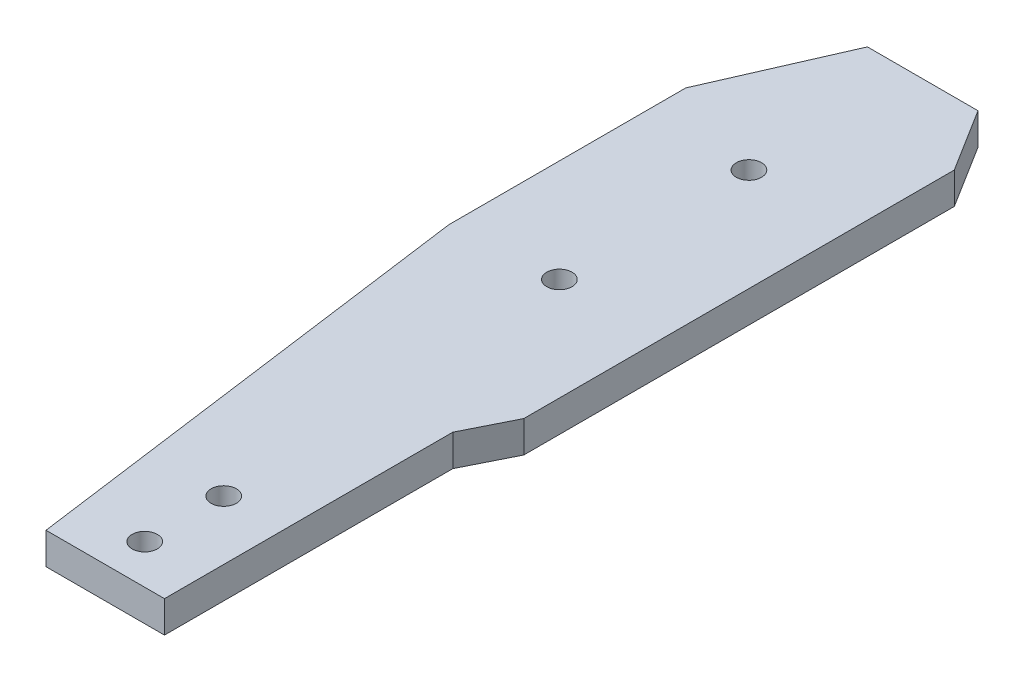
ISO-10303-21;
HEADER;
FILE_DESCRIPTION(('STEP AP214'),'2;1');
FILE_NAME('part.step','',(''),(''),'','','');
FILE_SCHEMA(('AUTOMOTIVE_DESIGN { 1 0 10303 214 1 1 1 1 }'));
ENDSEC;
DATA;
#1=APPLICATION_CONTEXT('core data for automotive mechanical design processes');
#2=APPLICATION_PROTOCOL_DEFINITION('international standard','automotive_design',2000,#1);
#3=PRODUCT_CONTEXT('',#1,'mechanical');
#4=PRODUCT('Part','Part','',(#3));
#5=PRODUCT_RELATED_PRODUCT_CATEGORY('part','',(#4));
#6=PRODUCT_DEFINITION_FORMATION('','',#4);
#7=PRODUCT_DEFINITION_CONTEXT('part definition',#1,'design');
#8=PRODUCT_DEFINITION('design','',#6,#7);
#9=PRODUCT_DEFINITION_SHAPE('','',#8);
#10=(LENGTH_UNIT() NAMED_UNIT(*) SI_UNIT(.MILLI.,.METRE.));
#11=(NAMED_UNIT(*) PLANE_ANGLE_UNIT() SI_UNIT($,.RADIAN.));
#12=(NAMED_UNIT(*) SI_UNIT($,.STERADIAN.) SOLID_ANGLE_UNIT());
#13=UNCERTAINTY_MEASURE_WITH_UNIT(LENGTH_MEASURE(1.E-05),#10,'distance_accuracy_value','');
#14=(GEOMETRIC_REPRESENTATION_CONTEXT(3) GLOBAL_UNCERTAINTY_ASSIGNED_CONTEXT((#13)) GLOBAL_UNIT_ASSIGNED_CONTEXT((#10,
#11,#12)) REPRESENTATION_CONTEXT('',''));
#15=CARTESIAN_POINT('',(0.,0.,0.));
#16=DIRECTION('',(0.,0.,1.));
#17=DIRECTION('',(1.,0.,0.));
#18=AXIS2_PLACEMENT_3D('',#15,#16,#17);
#19=CARTESIAN_POINT('',(0.,4.,0.));
#20=DIRECTION('',(0.916157334902189,0.,0.400818834019707));
#21=DIRECTION('',(0.400818834019707,0.,-0.916157334902189));
#22=AXIS2_PLACEMENT_3D('',#19,#20,#21);
#23=PLANE('',#22);
#24=DIRECTION('',(-0.400818834019707,0.,0.916157334902189));
#25=VECTOR('',#24,1.);
#26=CARTESIAN_POINT('',(0.,0.,0.));
#27=LINE('',#26,#25);
#28=CARTESIAN_POINT('',(0.,0.,0.));
#29=VERTEX_POINT('',#28);
#30=CARTESIAN_POINT('',(-6.99999999999999,0.,16.));
#31=VERTEX_POINT('',#30);
#32=EDGE_CURVE('E152',#29,#31,#27,.T.);
#33=ORIENTED_EDGE('',*,*,#32,.T.);
#34=DIRECTION('',(0.,-1.,0.));
#35=VECTOR('',#34,1.);
#36=CARTESIAN_POINT('',(-6.99999999999999,4.,16.));
#37=LINE('',#36,#35);
#38=CARTESIAN_POINT('',(-6.99999999999999,4.,16.));
#39=VERTEX_POINT('',#38);
#40=EDGE_CURVE('E13',#39,#31,#37,.T.);
#41=ORIENTED_EDGE('',*,*,#40,.F.);
#42=DIRECTION('',(-0.400818834019707,0.,0.916157334902189));
#43=VECTOR('',#42,1.);
#44=CARTESIAN_POINT('',(0.,4.,0.));
#45=LINE('',#44,#43);
#46=CARTESIAN_POINT('',(0.,4.,0.));
#47=VERTEX_POINT('',#46);
#48=EDGE_CURVE('E169',#47,#39,#45,.T.);
#49=ORIENTED_EDGE('',*,*,#48,.F.);
#50=DIRECTION('',(0.,-1.,0.));
#51=VECTOR('',#50,1.);
#52=CARTESIAN_POINT('',(0.,4.,0.));
#53=LINE('',#52,#51);
#54=EDGE_CURVE('E148',#47,#29,#53,.T.);
#55=ORIENTED_EDGE('',*,*,#54,.T.);
#56=EDGE_LOOP('',(#33,#41,#49,#55));
#57=FACE_BOUND('',#56,.T.);
#58=ADVANCED_FACE('F50',(#57),#23,.F.);
#59=CARTESIAN_POINT('',(-6.99999999999999,4.,16.));
#60=DIRECTION('',(1.,0.,0.));
#61=DIRECTION('',(0.,0.,-1.));
#62=AXIS2_PLACEMENT_3D('',#59,#60,#61);
#63=PLANE('',#62);
#64=DIRECTION('',(0.,0.,1.));
#65=VECTOR('',#64,1.);
#66=CARTESIAN_POINT('',(-6.99999999999999,0.,16.));
#67=LINE('',#66,#65);
#68=CARTESIAN_POINT('',(-6.99999999999999,0.,46.));
#69=VERTEX_POINT('',#68);
#70=EDGE_CURVE('E155',#31,#69,#67,.T.);
#71=ORIENTED_EDGE('',*,*,#70,.T.);
#72=DIRECTION('',(0.,-1.,0.));
#73=VECTOR('',#72,1.);
#74=CARTESIAN_POINT('',(-6.99999999999999,4.,46.));
#75=LINE('',#74,#73);
#76=CARTESIAN_POINT('',(-6.99999999999999,4.,46.));
#77=VERTEX_POINT('',#76);
#78=EDGE_CURVE('E58',#77,#69,#75,.T.);
#79=ORIENTED_EDGE('',*,*,#78,.F.);
#80=DIRECTION('',(0.,0.,1.));
#81=VECTOR('',#80,1.);
#82=CARTESIAN_POINT('',(-6.99999999999999,4.,16.));
#83=LINE('',#82,#81);
#84=EDGE_CURVE('E112',#39,#77,#83,.T.);
#85=ORIENTED_EDGE('',*,*,#84,.F.);
#86=ORIENTED_EDGE('',*,*,#40,.T.);
#87=EDGE_LOOP('',(#71,#79,#85,#86));
#88=FACE_BOUND('',#87,.T.);
#89=ADVANCED_FACE('F267',(#88),#63,.F.);
#90=CARTESIAN_POINT('',(-6.99999999999999,4.,46.));
#91=DIRECTION('',(0.990932088180138,0.,-0.134363672973578));
#92=DIRECTION('',(-0.134363672973578,0.,-0.990932088180138));
#93=AXIS2_PLACEMENT_3D('',#90,#91,#92);
#94=PLANE('',#93);
#95=DIRECTION('',(0.134363672973578,0.,0.990932088180138));
#96=VECTOR('',#95,1.);
#97=CARTESIAN_POINT('',(-6.99999999999999,0.,46.));
#98=LINE('',#97,#96);
#99=CARTESIAN_POINT('',(1.00000000000001,0.,105.));
#100=VERTEX_POINT('',#99);
#101=EDGE_CURVE('E158',#69,#100,#98,.T.);
#102=ORIENTED_EDGE('',*,*,#101,.T.);
#103=DIRECTION('',(0.,-1.,0.));
#104=VECTOR('',#103,1.);
#105=CARTESIAN_POINT('',(1.00000000000001,4.,105.));
#106=LINE('',#105,#104);
#107=CARTESIAN_POINT('',(1.00000000000001,4.,105.));
#108=VERTEX_POINT('',#107);
#109=EDGE_CURVE('E179',#108,#100,#106,.T.);
#110=ORIENTED_EDGE('',*,*,#109,.F.);
#111=DIRECTION('',(0.134363672973578,0.,0.990932088180138));
#112=VECTOR('',#111,1.);
#113=CARTESIAN_POINT('',(-6.99999999999999,4.,46.));
#114=LINE('',#113,#112);
#115=EDGE_CURVE('E187',#77,#108,#114,.T.);
#116=ORIENTED_EDGE('',*,*,#115,.F.);
#117=ORIENTED_EDGE('',*,*,#78,.T.);
#118=EDGE_LOOP('',(#102,#110,#116,#117));
#119=FACE_BOUND('',#118,.T.);
#120=ADVANCED_FACE('F185',(#119),#94,.F.);
#121=CARTESIAN_POINT('',(1.00000000000001,4.,105.));
#122=DIRECTION('',(0.,0.,-1.));
#123=DIRECTION('',(-1.,0.,0.));
#124=AXIS2_PLACEMENT_3D('',#121,#122,#123);
#125=PLANE('',#124);
#126=DIRECTION('',(1.,0.,0.));
#127=VECTOR('',#126,1.);
#128=CARTESIAN_POINT('',(1.00000000000001,0.,105.));
#129=LINE('',#128,#127);
#130=CARTESIAN_POINT('',(16.,0.,105.));
#131=VERTEX_POINT('',#130);
#132=EDGE_CURVE('E160',#100,#131,#129,.T.);
#133=ORIENTED_EDGE('',*,*,#132,.T.);
#134=DIRECTION('',(0.,-1.,0.));
#135=VECTOR('',#134,1.);
#136=CARTESIAN_POINT('',(16.,4.,105.));
#137=LINE('',#136,#135);
#138=CARTESIAN_POINT('',(16.,4.,105.));
#139=VERTEX_POINT('',#138);
#140=EDGE_CURVE('E176',#139,#131,#137,.T.);
#141=ORIENTED_EDGE('',*,*,#140,.F.);
#142=DIRECTION('',(1.,0.,0.));
#143=VECTOR('',#142,1.);
#144=CARTESIAN_POINT('',(1.00000000000001,4.,105.));
#145=LINE('',#144,#143);
#146=EDGE_CURVE('E203',#108,#139,#145,.T.);
#147=ORIENTED_EDGE('',*,*,#146,.F.);
#148=ORIENTED_EDGE('',*,*,#109,.T.);
#149=EDGE_LOOP('',(#133,#141,#147,#148));
#150=FACE_BOUND('',#149,.T.);
#151=ADVANCED_FACE('F196',(#150),#125,.F.);
#152=CARTESIAN_POINT('',(16.,4.,105.));
#153=DIRECTION('',(-1.,0.,0.));
#154=DIRECTION('',(0.,0.,1.));
#155=AXIS2_PLACEMENT_3D('',#152,#153,#154);
#156=PLANE('',#155);
#157=DIRECTION('',(0.,0.,-1.));
#158=VECTOR('',#157,1.);
#159=CARTESIAN_POINT('',(16.,0.,105.));
#160=LINE('',#159,#158);
#161=CARTESIAN_POINT('',(16.,0.,68.5));
#162=VERTEX_POINT('',#161);
#163=EDGE_CURVE('E162',#131,#162,#160,.T.);
#164=ORIENTED_EDGE('',*,*,#163,.T.);
#165=DIRECTION('',(0.,-1.,0.));
#166=VECTOR('',#165,1.);
#167=CARTESIAN_POINT('',(16.,4.,68.5));
#168=LINE('',#167,#166);
#169=CARTESIAN_POINT('',(16.,4.,68.5));
#170=VERTEX_POINT('',#169);
#171=EDGE_CURVE('E173',#170,#162,#168,.T.);
#172=ORIENTED_EDGE('',*,*,#171,.F.);
#173=DIRECTION('',(0.,0.,-1.));
#174=VECTOR('',#173,1.);
#175=CARTESIAN_POINT('',(16.,4.,105.));
#176=LINE('',#175,#174);
#177=EDGE_CURVE('E202',#139,#170,#176,.T.);
#178=ORIENTED_EDGE('',*,*,#177,.F.);
#179=ORIENTED_EDGE('',*,*,#140,.T.);
#180=EDGE_LOOP('',(#164,#172,#178,#179));
#181=FACE_BOUND('',#180,.T.);
#182=ADVANCED_FACE('F200',(#181),#156,.F.);
#183=CARTESIAN_POINT('',(16.,4.,68.5));
#184=DIRECTION('',(-0.894427190999916,0.,-0.447213595499958));
#185=DIRECTION('',(-0.447213595499958,0.,0.894427190999916));
#186=AXIS2_PLACEMENT_3D('',#183,#184,#185);
#187=PLANE('',#186);
#188=DIRECTION('',(0.447213595499958,0.,-0.894427190999916));
#189=VECTOR('',#188,1.);
#190=CARTESIAN_POINT('',(16.,0.,68.5));
#191=LINE('',#190,#189);
#192=CARTESIAN_POINT('',(19.,0.,62.5));
#193=VERTEX_POINT('',#192);
#194=EDGE_CURVE('E164',#162,#193,#191,.T.);
#195=ORIENTED_EDGE('',*,*,#194,.T.);
#196=DIRECTION('',(0.,-1.,0.));
#197=VECTOR('',#196,1.);
#198=CARTESIAN_POINT('',(19.,4.,62.5));
#199=LINE('',#198,#197);
#200=CARTESIAN_POINT('',(19.,4.,62.5));
#201=VERTEX_POINT('',#200);
#202=EDGE_CURVE('E143',#201,#193,#199,.T.);
#203=ORIENTED_EDGE('',*,*,#202,.F.);
#204=DIRECTION('',(0.447213595499958,0.,-0.894427190999916));
#205=VECTOR('',#204,1.);
#206=CARTESIAN_POINT('',(16.,4.,68.5));
#207=LINE('',#206,#205);
#208=EDGE_CURVE('E134',#170,#201,#207,.T.);
#209=ORIENTED_EDGE('',*,*,#208,.F.);
#210=ORIENTED_EDGE('',*,*,#171,.T.);
#211=EDGE_LOOP('',(#195,#203,#209,#210));
#212=FACE_BOUND('',#211,.T.);
#213=ADVANCED_FACE('F275',(#212),#187,.F.);
#214=CARTESIAN_POINT('',(19.,4.,62.5));
#215=DIRECTION('',(-1.,0.,0.));
#216=DIRECTION('',(0.,0.,1.));
#217=AXIS2_PLACEMENT_3D('',#214,#215,#216);
#218=PLANE('',#217);
#219=DIRECTION('',(0.,0.,-1.));
#220=VECTOR('',#219,1.);
#221=CARTESIAN_POINT('',(19.,0.,62.5));
#222=LINE('',#221,#220);
#223=CARTESIAN_POINT('',(19.,0.,7.99999999999999));
#224=VERTEX_POINT('',#223);
#225=EDGE_CURVE('E142',#193,#224,#222,.T.);
#226=ORIENTED_EDGE('',*,*,#225,.T.);
#227=DIRECTION('',(0.,-1.,0.));
#228=VECTOR('',#227,1.);
#229=CARTESIAN_POINT('',(19.,4.,7.99999999999999));
#230=LINE('',#229,#228);
#231=CARTESIAN_POINT('',(19.,4.,7.99999999999999));
#232=VERTEX_POINT('',#231);
#233=EDGE_CURVE('E139',#232,#224,#230,.T.);
#234=ORIENTED_EDGE('',*,*,#233,.F.);
#235=DIRECTION('',(0.,0.,-1.));
#236=VECTOR('',#235,1.);
#237=CARTESIAN_POINT('',(19.,4.,62.5));
#238=LINE('',#237,#236);
#239=EDGE_CURVE('E128',#201,#232,#238,.T.);
#240=ORIENTED_EDGE('',*,*,#239,.F.);
#241=ORIENTED_EDGE('',*,*,#202,.T.);
#242=EDGE_LOOP('',(#226,#234,#240,#241));
#243=FACE_BOUND('',#242,.T.);
#244=ADVANCED_FACE('F140',(#243),#218,.F.);
#245=CARTESIAN_POINT('',(19.,4.,7.99999999999999));
#246=DIRECTION('',(-0.847998304005088,0.,0.529998940003181));
#247=DIRECTION('',(0.529998940003181,0.,0.847998304005088));
#248=AXIS2_PLACEMENT_3D('',#245,#246,#247);
#249=PLANE('',#248);
#250=DIRECTION('',(-0.529998940003181,0.,-0.847998304005088));
#251=VECTOR('',#250,1.);
#252=CARTESIAN_POINT('',(19.,0.,7.99999999999999));
#253=LINE('',#252,#251);
#254=CARTESIAN_POINT('',(14.,0.,0.));
#255=VERTEX_POINT('',#254);
#256=EDGE_CURVE('E98',#224,#255,#253,.T.);
#257=ORIENTED_EDGE('',*,*,#256,.T.);
#258=DIRECTION('',(0.,-1.,0.));
#259=VECTOR('',#258,1.);
#260=CARTESIAN_POINT('',(14.,4.,0.));
#261=LINE('',#260,#259);
#262=CARTESIAN_POINT('',(14.,4.,0.));
#263=VERTEX_POINT('',#262);
#264=EDGE_CURVE('E144',#263,#255,#261,.T.);
#265=ORIENTED_EDGE('',*,*,#264,.F.);
#266=DIRECTION('',(-0.529998940003181,0.,-0.847998304005088));
#267=VECTOR('',#266,1.);
#268=CARTESIAN_POINT('',(19.,4.,7.99999999999999));
#269=LINE('',#268,#267);
#270=EDGE_CURVE('E132',#232,#263,#269,.T.);
#271=ORIENTED_EDGE('',*,*,#270,.F.);
#272=ORIENTED_EDGE('',*,*,#233,.T.);
#273=EDGE_LOOP('',(#257,#265,#271,#272));
#274=FACE_BOUND('',#273,.T.);
#275=ADVANCED_FACE('F146',(#274),#249,.F.);
#276=CARTESIAN_POINT('',(14.,4.,0.));
#277=DIRECTION('',(0.,0.,1.));
#278=DIRECTION('',(1.,0.,0.));
#279=AXIS2_PLACEMENT_3D('',#276,#277,#278);
#280=PLANE('',#279);
#281=DIRECTION('',(-1.,0.,0.));
#282=VECTOR('',#281,1.);
#283=CARTESIAN_POINT('',(14.,0.,0.));
#284=LINE('',#283,#282);
#285=EDGE_CURVE('E104',#255,#29,#284,.T.);
#286=ORIENTED_EDGE('',*,*,#285,.T.);
#287=ORIENTED_EDGE('',*,*,#54,.F.);
#288=DIRECTION('',(-1.,0.,0.));
#289=VECTOR('',#288,1.);
#290=CARTESIAN_POINT('',(14.,4.,0.));
#291=LINE('',#290,#289);
#292=EDGE_CURVE('E66',#263,#47,#291,.T.);
#293=ORIENTED_EDGE('',*,*,#292,.F.);
#294=ORIENTED_EDGE('',*,*,#264,.T.);
#295=EDGE_LOOP('',(#286,#287,#293,#294));
#296=FACE_BOUND('',#295,.T.);
#297=ADVANCED_FACE('F245',(#296),#280,.F.);
#298=CARTESIAN_POINT('',(0.,4.,0.));
#299=DIRECTION('',(0.,1.,0.));
#300=DIRECTION('',(0.,0.,1.));
#301=AXIS2_PLACEMENT_3D('',#298,#299,#300);
#302=PLANE('',#301);
#303=CARTESIAN_POINT('',(6.00000000000001,4.,21.));
#304=DIRECTION('',(0.,1.,0.));
#305=DIRECTION('',(0.,0.,1.));
#306=AXIS2_PLACEMENT_3D('',#303,#304,#305);
#307=CIRCLE('',#306,1.6);
#308=CARTESIAN_POINT('',(6.00000000000001,4.,22.6));
#309=VERTEX_POINT('',#308);
#310=EDGE_CURVE('E228',#309,#309,#307,.T.);
#311=ORIENTED_EDGE('',*,*,#310,.F.);
#312=EDGE_LOOP('',(#311));
#313=FACE_BOUND('',#312,.T.);
#314=CARTESIAN_POINT('',(6.00000000000001,4.,45.));
#315=DIRECTION('',(0.,1.,0.));
#316=DIRECTION('',(0.,0.,1.));
#317=AXIS2_PLACEMENT_3D('',#314,#315,#316);
#318=CIRCLE('',#317,1.6);
#319=CARTESIAN_POINT('',(6.00000000000001,4.,46.6));
#320=VERTEX_POINT('',#319);
#321=EDGE_CURVE('E222',#320,#320,#318,.T.);
#322=ORIENTED_EDGE('',*,*,#321,.F.);
#323=EDGE_LOOP('',(#322));
#324=FACE_BOUND('',#323,.T.);
#325=CARTESIAN_POINT('',(8.50000000000001,4.,90.));
#326=DIRECTION('',(0.,1.,0.));
#327=DIRECTION('',(0.,0.,1.));
#328=AXIS2_PLACEMENT_3D('',#325,#326,#327);
#329=CIRCLE('',#328,1.6);
#330=CARTESIAN_POINT('',(8.50000000000001,4.,91.6));
#331=VERTEX_POINT('',#330);
#332=EDGE_CURVE('E216',#331,#331,#329,.T.);
#333=ORIENTED_EDGE('',*,*,#332,.F.);
#334=EDGE_LOOP('',(#333));
#335=FACE_BOUND('',#334,.T.);
#336=CARTESIAN_POINT('',(8.50000000000001,4.,100.));
#337=DIRECTION('',(0.,1.,0.));
#338=DIRECTION('',(0.,0.,1.));
#339=AXIS2_PLACEMENT_3D('',#336,#337,#338);
#340=CIRCLE('',#339,1.6);
#341=CARTESIAN_POINT('',(8.50000000000001,4.,101.6));
#342=VERTEX_POINT('',#341);
#343=EDGE_CURVE('E210',#342,#342,#340,.T.);
#344=ORIENTED_EDGE('',*,*,#343,.F.);
#345=EDGE_LOOP('',(#344));
#346=FACE_BOUND('',#345,.T.);
#347=ORIENTED_EDGE('',*,*,#48,.T.);
#348=ORIENTED_EDGE('',*,*,#84,.T.);
#349=ORIENTED_EDGE('',*,*,#115,.T.);
#350=ORIENTED_EDGE('',*,*,#146,.T.);
#351=ORIENTED_EDGE('',*,*,#177,.T.);
#352=ORIENTED_EDGE('',*,*,#208,.T.);
#353=ORIENTED_EDGE('',*,*,#239,.T.);
#354=ORIENTED_EDGE('',*,*,#270,.T.);
#355=ORIENTED_EDGE('',*,*,#292,.T.);
#356=EDGE_LOOP('',(#347,#348,#349,#350,#351,#352,#353,#354,#355));
#357=FACE_BOUND('',#356,.T.);
#358=ADVANCED_FACE('F130',(#313,#324,#335,#346,#357),#302,.T.);
#359=CARTESIAN_POINT('',(0.,0.,0.));
#360=DIRECTION('',(0.,1.,0.));
#361=DIRECTION('',(0.,0.,1.));
#362=AXIS2_PLACEMENT_3D('',#359,#360,#361);
#363=PLANE('',#362);
#364=CARTESIAN_POINT('',(6.00000000000001,0.,21.));
#365=DIRECTION('',(0.,1.,0.));
#366=DIRECTION('',(0.,0.,1.));
#367=AXIS2_PLACEMENT_3D('',#364,#365,#366);
#368=CIRCLE('',#367,1.6);
#369=CARTESIAN_POINT('',(6.00000000000001,0.,22.6));
#370=VERTEX_POINT('',#369);
#371=EDGE_CURVE('E156',#370,#370,#368,.T.);
#372=ORIENTED_EDGE('',*,*,#371,.T.);
#373=EDGE_LOOP('',(#372));
#374=FACE_BOUND('',#373,.T.);
#375=CARTESIAN_POINT('',(6.00000000000001,0.,45.));
#376=DIRECTION('',(0.,1.,0.));
#377=DIRECTION('',(0.,0.,1.));
#378=AXIS2_PLACEMENT_3D('',#375,#376,#377);
#379=CIRCLE('',#378,1.6);
#380=CARTESIAN_POINT('',(6.00000000000001,0.,46.6));
#381=VERTEX_POINT('',#380);
#382=EDGE_CURVE('E225',#381,#381,#379,.T.);
#383=ORIENTED_EDGE('',*,*,#382,.T.);
#384=EDGE_LOOP('',(#383));
#385=FACE_BOUND('',#384,.T.);
#386=CARTESIAN_POINT('',(8.50000000000001,0.,90.));
#387=DIRECTION('',(0.,1.,0.));
#388=DIRECTION('',(0.,0.,1.));
#389=AXIS2_PLACEMENT_3D('',#386,#387,#388);
#390=CIRCLE('',#389,1.6);
#391=CARTESIAN_POINT('',(8.50000000000001,0.,91.6));
#392=VERTEX_POINT('',#391);
#393=EDGE_CURVE('E219',#392,#392,#390,.T.);
#394=ORIENTED_EDGE('',*,*,#393,.T.);
#395=EDGE_LOOP('',(#394));
#396=FACE_BOUND('',#395,.T.);
#397=CARTESIAN_POINT('',(8.50000000000001,0.,100.));
#398=DIRECTION('',(0.,1.,0.));
#399=DIRECTION('',(0.,0.,1.));
#400=AXIS2_PLACEMENT_3D('',#397,#398,#399);
#401=CIRCLE('',#400,1.6);
#402=CARTESIAN_POINT('',(8.50000000000001,0.,101.6));
#403=VERTEX_POINT('',#402);
#404=EDGE_CURVE('E213',#403,#403,#401,.T.);
#405=ORIENTED_EDGE('',*,*,#404,.T.);
#406=EDGE_LOOP('',(#405));
#407=FACE_BOUND('',#406,.T.);
#408=ORIENTED_EDGE('',*,*,#32,.F.);
#409=ORIENTED_EDGE('',*,*,#285,.F.);
#410=ORIENTED_EDGE('',*,*,#256,.F.);
#411=ORIENTED_EDGE('',*,*,#225,.F.);
#412=ORIENTED_EDGE('',*,*,#194,.F.);
#413=ORIENTED_EDGE('',*,*,#163,.F.);
#414=ORIENTED_EDGE('',*,*,#132,.F.);
#415=ORIENTED_EDGE('',*,*,#101,.F.);
#416=ORIENTED_EDGE('',*,*,#70,.F.);
#417=EDGE_LOOP('',(#408,#409,#410,#411,#412,#413,#414,#415,#416));
#418=FACE_BOUND('',#417,.T.);
#419=ADVANCED_FACE('F191',(#374,#385,#396,#407,#418),#363,.F.);
#420=CARTESIAN_POINT('',(8.50000000000001,0.,100.));
#421=DIRECTION('',(0.,1.,0.));
#422=DIRECTION('',(0.,0.,1.));
#423=AXIS2_PLACEMENT_3D('',#420,#421,#422);
#424=CYLINDRICAL_SURFACE('',#423,1.6);
#425=ORIENTED_EDGE('',*,*,#404,.F.);
#426=EDGE_LOOP('',(#425));
#427=FACE_BOUND('',#426,.T.);
#428=ORIENTED_EDGE('',*,*,#343,.T.);
#429=EDGE_LOOP('',(#428));
#430=FACE_BOUND('',#429,.T.);
#431=ADVANCED_FACE('F253',(#427,#430),#424,.F.);
#432=CARTESIAN_POINT('',(8.50000000000001,0.,90.));
#433=DIRECTION('',(0.,1.,0.));
#434=DIRECTION('',(0.,0.,1.));
#435=AXIS2_PLACEMENT_3D('',#432,#433,#434);
#436=CYLINDRICAL_SURFACE('',#435,1.6);
#437=ORIENTED_EDGE('',*,*,#393,.F.);
#438=EDGE_LOOP('',(#437));
#439=FACE_BOUND('',#438,.T.);
#440=ORIENTED_EDGE('',*,*,#332,.T.);
#441=EDGE_LOOP('',(#440));
#442=FACE_BOUND('',#441,.T.);
#443=ADVANCED_FACE('F255',(#439,#442),#436,.F.);
#444=CARTESIAN_POINT('',(6.00000000000001,0.,45.));
#445=DIRECTION('',(0.,1.,0.));
#446=DIRECTION('',(0.,0.,1.));
#447=AXIS2_PLACEMENT_3D('',#444,#445,#446);
#448=CYLINDRICAL_SURFACE('',#447,1.6);
#449=ORIENTED_EDGE('',*,*,#382,.F.);
#450=EDGE_LOOP('',(#449));
#451=FACE_BOUND('',#450,.T.);
#452=ORIENTED_EDGE('',*,*,#321,.T.);
#453=EDGE_LOOP('',(#452));
#454=FACE_BOUND('',#453,.T.);
#455=ADVANCED_FACE('F239',(#451,#454),#448,.F.);
#456=CARTESIAN_POINT('',(6.00000000000001,0.,21.));
#457=DIRECTION('',(0.,1.,0.));
#458=DIRECTION('',(0.,0.,1.));
#459=AXIS2_PLACEMENT_3D('',#456,#457,#458);
#460=CYLINDRICAL_SURFACE('',#459,1.6);
#461=ORIENTED_EDGE('',*,*,#371,.F.);
#462=EDGE_LOOP('',(#461));
#463=FACE_BOUND('',#462,.T.);
#464=ORIENTED_EDGE('',*,*,#310,.T.);
#465=EDGE_LOOP('',(#464));
#466=FACE_BOUND('',#465,.T.);
#467=ADVANCED_FACE('F236',(#463,#466),#460,.F.);
#468=CLOSED_SHELL('',(#58,#89,#120,#151,#182,#213,#244,#275,#297,#358,#419,#431,#443,#455,#467));
#469=MANIFOLD_SOLID_BREP('B2',#468);
#470=ADVANCED_BREP_SHAPE_REPRESENTATION('',(#18,#469),#14);
#471=SHAPE_DEFINITION_REPRESENTATION(#9,#470);
ENDSEC;
END-ISO-10303-21;
